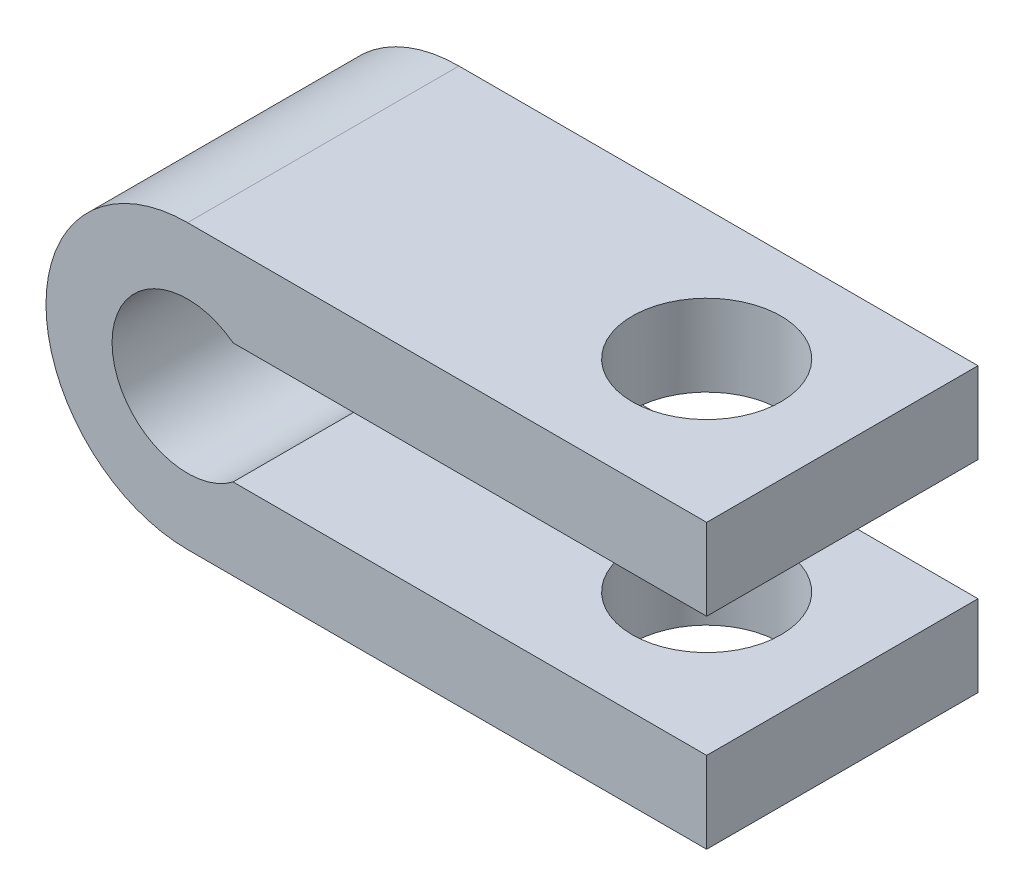
ISO-10303-21;
HEADER;
FILE_DESCRIPTION(('STEP AP214'),'2;1');
FILE_NAME('part.step','',(''),(''),'','','');
FILE_SCHEMA(('AUTOMOTIVE_DESIGN { 1 0 10303 214 1 1 1 1 }'));
ENDSEC;
DATA;
#1=APPLICATION_CONTEXT('core data for automotive mechanical design processes');
#2=APPLICATION_PROTOCOL_DEFINITION('international standard','automotive_design',2000,#1);
#3=PRODUCT_CONTEXT('',#1,'mechanical');
#4=PRODUCT('Part','Part','',(#3));
#5=PRODUCT_RELATED_PRODUCT_CATEGORY('part','',(#4));
#6=PRODUCT_DEFINITION_FORMATION('','',#4);
#7=PRODUCT_DEFINITION_CONTEXT('part definition',#1,'design');
#8=PRODUCT_DEFINITION('design','',#6,#7);
#9=PRODUCT_DEFINITION_SHAPE('','',#8);
#10=(LENGTH_UNIT() NAMED_UNIT(*) SI_UNIT(.MILLI.,.METRE.));
#11=(NAMED_UNIT(*) PLANE_ANGLE_UNIT() SI_UNIT($,.RADIAN.));
#12=(NAMED_UNIT(*) SI_UNIT($,.STERADIAN.) SOLID_ANGLE_UNIT());
#13=UNCERTAINTY_MEASURE_WITH_UNIT(LENGTH_MEASURE(1.E-05),#10,'distance_accuracy_value','');
#14=(GEOMETRIC_REPRESENTATION_CONTEXT(3) GLOBAL_UNCERTAINTY_ASSIGNED_CONTEXT((#13)) GLOBAL_UNIT_ASSIGNED_CONTEXT((#10,
#11,#12)) REPRESENTATION_CONTEXT('',''));
#15=CARTESIAN_POINT('',(0.,0.,0.));
#16=DIRECTION('',(0.,0.,1.));
#17=DIRECTION('',(1.,0.,0.));
#18=AXIS2_PLACEMENT_3D('',#15,#16,#17);
#19=CARTESIAN_POINT('',(0.,0.,12.));
#20=DIRECTION('',(0.,0.,-1.));
#21=DIRECTION('',(-1.,0.,0.));
#22=AXIS2_PLACEMENT_3D('',#19,#20,#21);
#23=CYLINDRICAL_SURFACE('',#22,3.2);
#24=DIRECTION('',(0.,0.,-1.));
#25=VECTOR('',#24,1.);
#26=CARTESIAN_POINT('',(1.92968099110157,-2.55271057360235,12.));
#27=LINE('',#26,#25);
#28=CARTESIAN_POINT('',(1.92968099110157,-2.55271057360235,12.));
#29=VERTEX_POINT('',#28);
#30=CARTESIAN_POINT('',(1.92968099110157,-2.55271057360235,0.499999999999995));
#31=VERTEX_POINT('',#30);
#32=EDGE_CURVE('E253',#29,#31,#27,.T.);
#33=ORIENTED_EDGE('',*,*,#32,.T.);
#34=CARTESIAN_POINT('',(0.,0.,0.499999999999995));
#35=DIRECTION('',(0.,0.,1.));
#36=DIRECTION('',(1.,0.,0.));
#37=AXIS2_PLACEMENT_3D('',#34,#35,#36);
#38=CIRCLE('',#37,3.2);
#39=CARTESIAN_POINT('',(1.92968099110157,2.55271057360235,0.499999999999995));
#40=VERTEX_POINT('',#39);
#41=EDGE_CURVE('E11',#31,#40,#38,.F.);
#42=ORIENTED_EDGE('',*,*,#41,.T.);
#43=DIRECTION('',(0.,0.,-1.));
#44=VECTOR('',#43,1.);
#45=CARTESIAN_POINT('',(1.92968099110157,2.55271057360235,12.));
#46=LINE('',#45,#44);
#47=CARTESIAN_POINT('',(1.92968099110157,2.55271057360235,12.));
#48=VERTEX_POINT('',#47);
#49=EDGE_CURVE('E127',#48,#40,#46,.T.);
#50=ORIENTED_EDGE('',*,*,#49,.F.);
#51=CARTESIAN_POINT('',(0.,0.,12.));
#52=DIRECTION('',(0.,0.,-1.));
#53=DIRECTION('',(1.,0.,0.));
#54=AXIS2_PLACEMENT_3D('',#51,#52,#53);
#55=CIRCLE('',#54,3.2);
#56=EDGE_CURVE('E134',#29,#48,#55,.T.);
#57=ORIENTED_EDGE('',*,*,#56,.F.);
#58=EDGE_LOOP('',(#33,#42,#50,#57));
#59=FACE_BOUND('',#58,.T.);
#60=ADVANCED_FACE('F34',(#59),#23,.F.);
#61=CARTESIAN_POINT('',(22.,2.55271057360236,12.));
#62=DIRECTION('',(0.,1.,0.));
#63=DIRECTION('',(-1.,0.,0.));
#64=AXIS2_PLACEMENT_3D('',#61,#62,#63);
#65=PLANE('',#64);
#66=CARTESIAN_POINT('',(16.,2.55271057360236,6.));
#67=DIRECTION('',(0.,1.,0.));
#68=DIRECTION('',(-1.,0.,0.));
#69=AXIS2_PLACEMENT_3D('',#66,#67,#68);
#70=CIRCLE('',#69,3.15);
#71=CARTESIAN_POINT('',(12.85,2.55271057360236,6.));
#72=VERTEX_POINT('',#71);
#73=EDGE_CURVE('E140',#72,#72,#70,.T.);
#74=ORIENTED_EDGE('',*,*,#73,.T.);
#75=EDGE_LOOP('',(#74));
#76=FACE_BOUND('',#75,.T.);
#77=ORIENTED_EDGE('',*,*,#49,.T.);
#78=DIRECTION('',(1.,0.,0.));
#79=VECTOR('',#78,1.);
#80=CARTESIAN_POINT('',(22.,2.55271057360236,0.499999999999995));
#81=LINE('',#80,#79);
#82=CARTESIAN_POINT('',(22.,2.55271057360236,0.499999999999995));
#83=VERTEX_POINT('',#82);
#84=EDGE_CURVE('E179',#40,#83,#81,.T.);
#85=ORIENTED_EDGE('',*,*,#84,.T.);
#86=DIRECTION('',(0.,0.,-1.));
#87=VECTOR('',#86,1.);
#88=CARTESIAN_POINT('',(22.,2.55271057360236,12.));
#89=LINE('',#88,#87);
#90=CARTESIAN_POINT('',(22.,2.55271057360236,12.));
#91=VERTEX_POINT('',#90);
#92=EDGE_CURVE('E130',#91,#83,#89,.T.);
#93=ORIENTED_EDGE('',*,*,#92,.F.);
#94=DIRECTION('',(1.,0.,0.));
#95=VECTOR('',#94,1.);
#96=CARTESIAN_POINT('',(22.,2.55271057360236,12.));
#97=LINE('',#96,#95);
#98=EDGE_CURVE('E124',#48,#91,#97,.T.);
#99=ORIENTED_EDGE('',*,*,#98,.F.);
#100=EDGE_LOOP('',(#77,#85,#93,#99));
#101=FACE_BOUND('',#100,.T.);
#102=ADVANCED_FACE('F126',(#76,#101),#65,.F.);
#103=CARTESIAN_POINT('',(22.,6.,12.));
#104=DIRECTION('',(-1.,0.,0.));
#105=DIRECTION('',(0.,0.,1.));
#106=AXIS2_PLACEMENT_3D('',#103,#104,#105);
#107=PLANE('',#106);
#108=ORIENTED_EDGE('',*,*,#92,.T.);
#109=DIRECTION('',(0.,1.,0.));
#110=VECTOR('',#109,1.);
#111=CARTESIAN_POINT('',(22.,6.,0.499999999999995));
#112=LINE('',#111,#110);
#113=CARTESIAN_POINT('',(22.,6.,0.499999999999995));
#114=VERTEX_POINT('',#113);
#115=EDGE_CURVE('E177',#83,#114,#112,.T.);
#116=ORIENTED_EDGE('',*,*,#115,.T.);
#117=DIRECTION('',(0.,0.,-1.));
#118=VECTOR('',#117,1.);
#119=CARTESIAN_POINT('',(22.,6.,12.));
#120=LINE('',#119,#118);
#121=CARTESIAN_POINT('',(22.,6.,12.));
#122=VERTEX_POINT('',#121);
#123=EDGE_CURVE('E147',#122,#114,#120,.T.);
#124=ORIENTED_EDGE('',*,*,#123,.F.);
#125=DIRECTION('',(0.,1.,0.));
#126=VECTOR('',#125,1.);
#127=CARTESIAN_POINT('',(22.,6.,12.));
#128=LINE('',#127,#126);
#129=EDGE_CURVE('E133',#91,#122,#128,.T.);
#130=ORIENTED_EDGE('',*,*,#129,.F.);
#131=EDGE_LOOP('',(#108,#116,#124,#130));
#132=FACE_BOUND('',#131,.T.);
#133=ADVANCED_FACE('F292',(#132),#107,.F.);
#134=CARTESIAN_POINT('',(0.,6.,12.));
#135=DIRECTION('',(0.,-1.,0.));
#136=DIRECTION('',(0.,0.,-1.));
#137=AXIS2_PLACEMENT_3D('',#134,#135,#136);
#138=PLANE('',#137);
#139=CARTESIAN_POINT('',(16.,6.,6.));
#140=DIRECTION('',(0.,1.,0.));
#141=DIRECTION('',(0.,0.,1.));
#142=AXIS2_PLACEMENT_3D('',#139,#140,#141);
#143=CIRCLE('',#142,3.15);
#144=CARTESIAN_POINT('',(16.,6.,9.15));
#145=VERTEX_POINT('',#144);
#146=EDGE_CURVE('E229',#145,#145,#143,.T.);
#147=ORIENTED_EDGE('',*,*,#146,.F.);
#148=EDGE_LOOP('',(#147));
#149=FACE_BOUND('',#148,.T.);
#150=ORIENTED_EDGE('',*,*,#123,.T.);
#151=DIRECTION('',(-1.,0.,0.));
#152=VECTOR('',#151,1.);
#153=CARTESIAN_POINT('',(0.,6.,0.499999999999995));
#154=LINE('',#153,#152);
#155=CARTESIAN_POINT('',(0.,6.,0.499999999999995));
#156=VERTEX_POINT('',#155);
#157=EDGE_CURVE('E175',#114,#156,#154,.T.);
#158=ORIENTED_EDGE('',*,*,#157,.T.);
#159=DIRECTION('',(0.,0.,-1.));
#160=VECTOR('',#159,1.);
#161=CARTESIAN_POINT('',(0.,6.,12.));
#162=LINE('',#161,#160);
#163=CARTESIAN_POINT('',(0.,6.,12.));
#164=VERTEX_POINT('',#163);
#165=EDGE_CURVE('E263',#164,#156,#162,.T.);
#166=ORIENTED_EDGE('',*,*,#165,.F.);
#167=DIRECTION('',(-1.,0.,0.));
#168=VECTOR('',#167,1.);
#169=CARTESIAN_POINT('',(0.,6.,12.));
#170=LINE('',#169,#168);
#171=EDGE_CURVE('E244',#122,#164,#170,.T.);
#172=ORIENTED_EDGE('',*,*,#171,.F.);
#173=EDGE_LOOP('',(#150,#158,#166,#172));
#174=FACE_BOUND('',#173,.T.);
#175=ADVANCED_FACE('F269',(#149,#174),#138,.F.);
#176=CARTESIAN_POINT('',(0.,0.,12.));
#177=DIRECTION('',(0.,0.,-1.));
#178=DIRECTION('',(-1.,0.,0.));
#179=AXIS2_PLACEMENT_3D('',#176,#177,#178);
#180=CYLINDRICAL_SURFACE('',#179,6.);
#181=ORIENTED_EDGE('',*,*,#165,.T.);
#182=CARTESIAN_POINT('',(0.,0.,0.499999999999995));
#183=DIRECTION('',(0.,0.,1.));
#184=DIRECTION('',(1.,0.,0.));
#185=AXIS2_PLACEMENT_3D('',#182,#183,#184);
#186=CIRCLE('',#185,6.);
#187=CARTESIAN_POINT('',(0.,-6.,0.499999999999995));
#188=VERTEX_POINT('',#187);
#189=EDGE_CURVE('E173',#156,#188,#186,.T.);
#190=ORIENTED_EDGE('',*,*,#189,.T.);
#191=DIRECTION('',(0.,0.,-1.));
#192=VECTOR('',#191,1.);
#193=CARTESIAN_POINT('',(0.,-6.,12.));
#194=LINE('',#193,#192);
#195=CARTESIAN_POINT('',(0.,-6.,12.));
#196=VERTEX_POINT('',#195);
#197=EDGE_CURVE('E260',#196,#188,#194,.T.);
#198=ORIENTED_EDGE('',*,*,#197,.F.);
#199=CARTESIAN_POINT('',(0.,0.,12.));
#200=DIRECTION('',(0.,0.,1.));
#201=DIRECTION('',(1.,0.,0.));
#202=AXIS2_PLACEMENT_3D('',#199,#200,#201);
#203=CIRCLE('',#202,6.);
#204=EDGE_CURVE('E246',#164,#196,#203,.T.);
#205=ORIENTED_EDGE('',*,*,#204,.F.);
#206=EDGE_LOOP('',(#181,#190,#198,#205));
#207=FACE_BOUND('',#206,.T.);
#208=ADVANCED_FACE('F284',(#207),#180,.T.);
#209=CARTESIAN_POINT('',(0.,-6.,12.));
#210=DIRECTION('',(0.,1.,0.));
#211=DIRECTION('',(0.,0.,1.));
#212=AXIS2_PLACEMENT_3D('',#209,#210,#211);
#213=PLANE('',#212);
#214=CARTESIAN_POINT('',(16.,-6.,6.));
#215=DIRECTION('',(0.,1.,0.));
#216=DIRECTION('',(0.,0.,1.));
#217=AXIS2_PLACEMENT_3D('',#214,#215,#216);
#218=CIRCLE('',#217,3.15);
#219=CARTESIAN_POINT('',(16.,-6.,9.15));
#220=VERTEX_POINT('',#219);
#221=EDGE_CURVE('E153',#220,#220,#218,.T.);
#222=ORIENTED_EDGE('',*,*,#221,.T.);
#223=EDGE_LOOP('',(#222));
#224=FACE_BOUND('',#223,.T.);
#225=ORIENTED_EDGE('',*,*,#197,.T.);
#226=DIRECTION('',(1.,0.,0.));
#227=VECTOR('',#226,1.);
#228=CARTESIAN_POINT('',(0.,-6.,0.499999999999995));
#229=LINE('',#228,#227);
#230=CARTESIAN_POINT('',(22.,-6.,0.499999999999995));
#231=VERTEX_POINT('',#230);
#232=EDGE_CURVE('E171',#188,#231,#229,.T.);
#233=ORIENTED_EDGE('',*,*,#232,.T.);
#234=DIRECTION('',(0.,0.,-1.));
#235=VECTOR('',#234,1.);
#236=CARTESIAN_POINT('',(22.,-6.,12.));
#237=LINE('',#236,#235);
#238=CARTESIAN_POINT('',(22.,-6.,12.));
#239=VERTEX_POINT('',#238);
#240=EDGE_CURVE('E257',#239,#231,#237,.T.);
#241=ORIENTED_EDGE('',*,*,#240,.F.);
#242=DIRECTION('',(1.,0.,0.));
#243=VECTOR('',#242,1.);
#244=CARTESIAN_POINT('',(0.,-6.,12.));
#245=LINE('',#244,#243);
#246=EDGE_CURVE('E248',#196,#239,#245,.T.);
#247=ORIENTED_EDGE('',*,*,#246,.F.);
#248=EDGE_LOOP('',(#225,#233,#241,#247));
#249=FACE_BOUND('',#248,.T.);
#250=ADVANCED_FACE('F288',(#224,#249),#213,.F.);
#251=CARTESIAN_POINT('',(22.,-6.,12.));
#252=DIRECTION('',(-1.,0.,0.));
#253=DIRECTION('',(0.,0.,1.));
#254=AXIS2_PLACEMENT_3D('',#251,#252,#253);
#255=PLANE('',#254);
#256=ORIENTED_EDGE('',*,*,#240,.T.);
#257=DIRECTION('',(0.,1.,0.));
#258=VECTOR('',#257,1.);
#259=CARTESIAN_POINT('',(22.,-6.,0.499999999999995));
#260=LINE('',#259,#258);
#261=CARTESIAN_POINT('',(22.,-2.55271057360236,0.499999999999995));
#262=VERTEX_POINT('',#261);
#263=EDGE_CURVE('E142',#231,#262,#260,.T.);
#264=ORIENTED_EDGE('',*,*,#263,.T.);
#265=DIRECTION('',(0.,0.,-1.));
#266=VECTOR('',#265,1.);
#267=CARTESIAN_POINT('',(22.,-2.55271057360236,12.));
#268=LINE('',#267,#266);
#269=CARTESIAN_POINT('',(22.,-2.55271057360236,12.));
#270=VERTEX_POINT('',#269);
#271=EDGE_CURVE('E255',#270,#262,#268,.T.);
#272=ORIENTED_EDGE('',*,*,#271,.F.);
#273=DIRECTION('',(0.,1.,0.));
#274=VECTOR('',#273,1.);
#275=CARTESIAN_POINT('',(22.,-6.,12.));
#276=LINE('',#275,#274);
#277=EDGE_CURVE('E250',#239,#270,#276,.T.);
#278=ORIENTED_EDGE('',*,*,#277,.F.);
#279=EDGE_LOOP('',(#256,#264,#272,#278));
#280=FACE_BOUND('',#279,.T.);
#281=ADVANCED_FACE('F322',(#280),#255,.F.);
#282=CARTESIAN_POINT('',(22.,-2.55271057360236,12.));
#283=DIRECTION('',(0.,-1.,0.));
#284=DIRECTION('',(1.,0.,0.));
#285=AXIS2_PLACEMENT_3D('',#282,#283,#284);
#286=PLANE('',#285);
#287=CARTESIAN_POINT('',(16.,-2.55271057360236,6.));
#288=DIRECTION('',(0.,-1.,0.));
#289=DIRECTION('',(1.,0.,0.));
#290=AXIS2_PLACEMENT_3D('',#287,#288,#289);
#291=CIRCLE('',#290,3.15);
#292=CARTESIAN_POINT('',(19.15,-2.55271057360236,6.));
#293=VERTEX_POINT('',#292);
#294=EDGE_CURVE('E151',#293,#293,#291,.T.);
#295=ORIENTED_EDGE('',*,*,#294,.T.);
#296=EDGE_LOOP('',(#295));
#297=FACE_BOUND('',#296,.T.);
#298=ORIENTED_EDGE('',*,*,#271,.T.);
#299=DIRECTION('',(-1.,0.,0.));
#300=VECTOR('',#299,1.);
#301=CARTESIAN_POINT('',(22.,-2.55271057360236,0.499999999999995));
#302=LINE('',#301,#300);
#303=EDGE_CURVE('E43',#262,#31,#302,.T.);
#304=ORIENTED_EDGE('',*,*,#303,.T.);
#305=ORIENTED_EDGE('',*,*,#32,.F.);
#306=DIRECTION('',(-1.,0.,0.));
#307=VECTOR('',#306,1.);
#308=CARTESIAN_POINT('',(22.,-2.55271057360236,12.));
#309=LINE('',#308,#307);
#310=EDGE_CURVE('E139',#270,#29,#309,.T.);
#311=ORIENTED_EDGE('',*,*,#310,.F.);
#312=EDGE_LOOP('',(#298,#304,#305,#311));
#313=FACE_BOUND('',#312,.T.);
#314=ADVANCED_FACE('F323',(#297,#313),#286,.F.);
#315=CARTESIAN_POINT('',(0.,0.,12.));
#316=DIRECTION('',(0.,0.,1.));
#317=DIRECTION('',(1.,0.,0.));
#318=AXIS2_PLACEMENT_3D('',#315,#316,#317);
#319=PLANE('',#318);
#320=ORIENTED_EDGE('',*,*,#56,.T.);
#321=ORIENTED_EDGE('',*,*,#98,.T.);
#322=ORIENTED_EDGE('',*,*,#129,.T.);
#323=ORIENTED_EDGE('',*,*,#171,.T.);
#324=ORIENTED_EDGE('',*,*,#204,.T.);
#325=ORIENTED_EDGE('',*,*,#246,.T.);
#326=ORIENTED_EDGE('',*,*,#277,.T.);
#327=ORIENTED_EDGE('',*,*,#310,.T.);
#328=EDGE_LOOP('',(#320,#321,#322,#323,#324,#325,#326,#327));
#329=FACE_BOUND('',#328,.T.);
#330=ADVANCED_FACE('F137',(#329),#319,.T.);
#331=CARTESIAN_POINT('',(0.,0.,0.));
#332=DIRECTION('',(0.,0.,1.));
#333=DIRECTION('',(1.,0.,0.));
#334=AXIS2_PLACEMENT_3D('',#331,#332,#333);
#335=PLANE('',#334);
#336=DIRECTION('',(1.,0.,0.));
#337=VECTOR('',#336,1.);
#338=CARTESIAN_POINT('',(0.,-3.05271057360235,0.));
#339=LINE('',#338,#337);
#340=CARTESIAN_POINT('',(2.09068365704054,-3.05271057360235,0.));
#341=VERTEX_POINT('',#340);
#342=CARTESIAN_POINT('',(21.5,-3.05271057360236,0.));
#343=VERTEX_POINT('',#342);
#344=EDGE_CURVE('E156',#341,#343,#339,.T.);
#345=ORIENTED_EDGE('',*,*,#344,.T.);
#346=DIRECTION('',(0.,-1.,0.));
#347=VECTOR('',#346,1.);
#348=CARTESIAN_POINT('',(21.5,0.,0.));
#349=LINE('',#348,#347);
#350=CARTESIAN_POINT('',(21.5,-5.5,0.));
#351=VERTEX_POINT('',#350);
#352=EDGE_CURVE('E168',#343,#351,#349,.T.);
#353=ORIENTED_EDGE('',*,*,#352,.T.);
#354=DIRECTION('',(-1.,0.,0.));
#355=VECTOR('',#354,1.);
#356=CARTESIAN_POINT('',(0.,-5.5,0.));
#357=LINE('',#356,#355);
#358=CARTESIAN_POINT('',(0.,-5.5,0.));
#359=VERTEX_POINT('',#358);
#360=EDGE_CURVE('E166',#351,#359,#357,.T.);
#361=ORIENTED_EDGE('',*,*,#360,.T.);
#362=CARTESIAN_POINT('',(0.,0.,0.));
#363=DIRECTION('',(0.,0.,1.));
#364=DIRECTION('',(1.,0.,0.));
#365=AXIS2_PLACEMENT_3D('',#362,#363,#364);
#366=CIRCLE('',#365,5.5);
#367=CARTESIAN_POINT('',(0.,5.5,0.));
#368=VERTEX_POINT('',#367);
#369=EDGE_CURVE('E164',#359,#368,#366,.F.);
#370=ORIENTED_EDGE('',*,*,#369,.T.);
#371=DIRECTION('',(1.,0.,0.));
#372=VECTOR('',#371,1.);
#373=CARTESIAN_POINT('',(0.,5.5,0.));
#374=LINE('',#373,#372);
#375=CARTESIAN_POINT('',(21.5,5.5,0.));
#376=VERTEX_POINT('',#375);
#377=EDGE_CURVE('E162',#368,#376,#374,.T.);
#378=ORIENTED_EDGE('',*,*,#377,.T.);
#379=DIRECTION('',(0.,-1.,0.));
#380=VECTOR('',#379,1.);
#381=CARTESIAN_POINT('',(21.5,0.,0.));
#382=LINE('',#381,#380);
#383=CARTESIAN_POINT('',(21.5,3.05271057360236,0.));
#384=VERTEX_POINT('',#383);
#385=EDGE_CURVE('E160',#376,#384,#382,.T.);
#386=ORIENTED_EDGE('',*,*,#385,.T.);
#387=DIRECTION('',(-1.,0.,0.));
#388=VECTOR('',#387,1.);
#389=CARTESIAN_POINT('',(0.,3.05271057360235,0.));
#390=LINE('',#389,#388);
#391=CARTESIAN_POINT('',(2.09068365704054,3.05271057360235,0.));
#392=VERTEX_POINT('',#391);
#393=EDGE_CURVE('E158',#384,#392,#390,.T.);
#394=ORIENTED_EDGE('',*,*,#393,.T.);
#395=CARTESIAN_POINT('',(0.,0.,0.));
#396=DIRECTION('',(0.,0.,1.));
#397=DIRECTION('',(1.,0.,0.));
#398=AXIS2_PLACEMENT_3D('',#395,#396,#397);
#399=CIRCLE('',#398,3.7);
#400=EDGE_CURVE('E145',#392,#341,#399,.T.);
#401=ORIENTED_EDGE('',*,*,#400,.T.);
#402=EDGE_LOOP('',(#345,#353,#361,#370,#378,#386,#394,#401));
#403=FACE_BOUND('',#402,.T.);
#404=ADVANCED_FACE('F317',(#403),#335,.F.);
#405=CARTESIAN_POINT('',(16.,-6.,6.));
#406=DIRECTION('',(0.,1.,0.));
#407=DIRECTION('',(0.,0.,1.));
#408=AXIS2_PLACEMENT_3D('',#405,#406,#407);
#409=CYLINDRICAL_SURFACE('',#408,3.15);
#410=ORIENTED_EDGE('',*,*,#221,.F.);
#411=EDGE_LOOP('',(#410));
#412=FACE_BOUND('',#411,.T.);
#413=ORIENTED_EDGE('',*,*,#294,.F.);
#414=EDGE_LOOP('',(#413));
#415=FACE_BOUND('',#414,.T.);
#416=ADVANCED_FACE('F354',(#412,#415),#409,.F.);
#417=ORIENTED_EDGE('',*,*,#146,.T.);
#418=EDGE_LOOP('',(#417));
#419=FACE_BOUND('',#418,.T.);
#420=ORIENTED_EDGE('',*,*,#73,.F.);
#421=EDGE_LOOP('',(#420));
#422=FACE_BOUND('',#421,.T.);
#423=ADVANCED_FACE('F347',(#419,#422),#409,.F.);
#424=CARTESIAN_POINT('',(22.,6.,0.499999999999995));
#425=DIRECTION('',(-0.707106781186546,0.,0.707106781186549));
#426=DIRECTION('',(0.,1.,0.));
#427=AXIS2_PLACEMENT_3D('',#424,#425,#426);
#428=PLANE('',#427);
#429=DIRECTION('',(0.577350269189626,-0.577350269189627,0.577350269189624));
#430=VECTOR('',#429,1.);
#431=CARTESIAN_POINT('',(22.,2.55271057360236,0.499999999999995));
#432=LINE('',#431,#430);
#433=EDGE_CURVE('E224',#384,#83,#432,.T.);
#434=ORIENTED_EDGE('',*,*,#433,.F.);
#435=ORIENTED_EDGE('',*,*,#385,.F.);
#436=DIRECTION('',(0.577350269189626,0.577350269189628,0.577350269189624));
#437=VECTOR('',#436,1.);
#438=CARTESIAN_POINT('',(22.,6.,0.499999999999995));
#439=LINE('',#438,#437);
#440=EDGE_CURVE('E38',#114,#376,#439,.F.);
#441=ORIENTED_EDGE('',*,*,#440,.F.);
#442=ORIENTED_EDGE('',*,*,#115,.F.);
#443=EDGE_LOOP('',(#434,#435,#441,#442));
#444=FACE_BOUND('',#443,.T.);
#445=ADVANCED_FACE('F36',(#444),#428,.F.);
#446=CARTESIAN_POINT('',(0.,6.,0.499999999999995));
#447=DIRECTION('',(0.,-0.707106781186545,0.70710678118655));
#448=DIRECTION('',(-1.,0.,0.));
#449=AXIS2_PLACEMENT_3D('',#446,#447,#448);
#450=PLANE('',#449);
#451=ORIENTED_EDGE('',*,*,#440,.T.);
#452=ORIENTED_EDGE('',*,*,#377,.F.);
#453=DIRECTION('',(0.,-0.70710678118655,-0.707106781186545));
#454=VECTOR('',#453,1.);
#455=CARTESIAN_POINT('',(0.,6.,0.499999999999995));
#456=LINE('',#455,#454);
#457=EDGE_CURVE('E222',#156,#368,#456,.T.);
#458=ORIENTED_EDGE('',*,*,#457,.F.);
#459=ORIENTED_EDGE('',*,*,#157,.F.);
#460=EDGE_LOOP('',(#451,#452,#458,#459));
#461=FACE_BOUND('',#460,.T.);
#462=ADVANCED_FACE('F214',(#461),#450,.F.);
#463=CARTESIAN_POINT('',(22.,2.55271057360236,0.499999999999995));
#464=DIRECTION('',(0.,0.707106781186546,0.707106781186549));
#465=DIRECTION('',(1.,0.,0.));
#466=AXIS2_PLACEMENT_3D('',#463,#464,#465);
#467=PLANE('',#466);
#468=ORIENTED_EDGE('',*,*,#433,.T.);
#469=ORIENTED_EDGE('',*,*,#84,.F.);
#470=CARTESIAN_POINT('',(2.09068365704054,3.05271057360235,0.));
#471=CARTESIAN_POINT('',(2.06487118529539,2.96921292662803,0.0834976469743253));
#472=CARTESIAN_POINT('',(2.03854807955508,2.885797493086,0.166913080516349));
#473=CARTESIAN_POINT('',(1.98488052702275,2.71913082597164,0.333579747630707));
#474=CARTESIAN_POINT('',(1.95753607745007,2.635879592847,0.416830980755348));
#475=CARTESIAN_POINT('',(1.92968099110157,2.55271057360235,0.499999999999995));
#476=B_SPLINE_CURVE_WITH_KNOTS('',3,(#470,#471,#472,#473,#474,#475),.UNSPECIFIED.,.F.,.F.,(4,2,
4),(0.,0.36260526060223,0.725211508485266),.UNSPECIFIED.);
#477=EDGE_CURVE('E216',#392,#40,#476,.T.);
#478=ORIENTED_EDGE('',*,*,#477,.F.);
#479=ORIENTED_EDGE('',*,*,#393,.F.);
#480=EDGE_LOOP('',(#468,#469,#478,#479));
#481=FACE_BOUND('',#480,.T.);
#482=ADVANCED_FACE('F209',(#481),#467,.F.);
#483=CARTESIAN_POINT('',(0.,0.,0.499999999999995));
#484=DIRECTION('',(0.,0.,1.));
#485=DIRECTION('',(1.,0.,0.));
#486=AXIS2_PLACEMENT_3D('',#483,#484,#485);
#487=CONICAL_SURFACE('',#486,6.,0.785398163397452);
#488=ORIENTED_EDGE('',*,*,#457,.T.);
#489=ORIENTED_EDGE('',*,*,#369,.F.);
#490=DIRECTION('',(0.,0.70710678118655,-0.707106781186545));
#491=VECTOR('',#490,1.);
#492=CARTESIAN_POINT('',(0.,-6.,0.499999999999995));
#493=LINE('',#492,#491);
#494=EDGE_CURVE('E194',#188,#359,#493,.T.);
#495=ORIENTED_EDGE('',*,*,#494,.F.);
#496=ORIENTED_EDGE('',*,*,#189,.F.);
#497=EDGE_LOOP('',(#488,#489,#495,#496));
#498=FACE_BOUND('',#497,.T.);
#499=ADVANCED_FACE('F213',(#498),#487,.T.);
#500=CARTESIAN_POINT('',(0.,0.,0.499999999999995));
#501=DIRECTION('',(0.,0.,-1.));
#502=DIRECTION('',(-1.,0.,0.));
#503=AXIS2_PLACEMENT_3D('',#500,#501,#502);
#504=CONICAL_SURFACE('',#503,3.2,0.785398163397451);
#505=ORIENTED_EDGE('',*,*,#477,.T.);
#506=ORIENTED_EDGE('',*,*,#41,.F.);
#507=CARTESIAN_POINT('',(1.92968099110157,-2.55271057360235,0.499999999999995));
#508=CARTESIAN_POINT('',(1.95753607745007,-2.635879592847,0.416830980755348));
#509=CARTESIAN_POINT('',(1.98488052702275,-2.71913082597164,0.333579747630707));
#510=CARTESIAN_POINT('',(2.03854807955508,-2.885797493086,0.166913080516349));
#511=CARTESIAN_POINT('',(2.06487118529539,-2.96921292662803,0.0834976469743251));
#512=CARTESIAN_POINT('',(2.09068365704054,-3.05271057360235,0.));
#513=B_SPLINE_CURVE_WITH_KNOTS('',3,(#507,#508,#509,#510,#511,#512),.UNSPECIFIED.,.F.,.F.,(4,2,
4),(0.,0.362606247883036,0.725211508485266),.UNSPECIFIED.);
#514=EDGE_CURVE('E186',#341,#31,#513,.F.);
#515=ORIENTED_EDGE('',*,*,#514,.F.);
#516=ORIENTED_EDGE('',*,*,#400,.F.);
#517=EDGE_LOOP('',(#505,#506,#515,#516));
#518=FACE_BOUND('',#517,.T.);
#519=ADVANCED_FACE('F196',(#518),#504,.F.);
#520=CARTESIAN_POINT('',(0.,-6.,0.499999999999995));
#521=DIRECTION('',(0.,0.707106781186545,0.70710678118655));
#522=DIRECTION('',(1.,0.,0.));
#523=AXIS2_PLACEMENT_3D('',#520,#521,#522);
#524=PLANE('',#523);
#525=ORIENTED_EDGE('',*,*,#494,.T.);
#526=ORIENTED_EDGE('',*,*,#360,.F.);
#527=DIRECTION('',(0.577350269189626,-0.577350269189628,0.577350269189624));
#528=VECTOR('',#527,1.);
#529=CARTESIAN_POINT('',(14.6666666666667,1.33333333333336,-6.83333333333331));
#530=LINE('',#529,#528);
#531=EDGE_CURVE('E184',#231,#351,#530,.F.);
#532=ORIENTED_EDGE('',*,*,#531,.F.);
#533=ORIENTED_EDGE('',*,*,#232,.F.);
#534=EDGE_LOOP('',(#525,#526,#532,#533));
#535=FACE_BOUND('',#534,.T.);
#536=ADVANCED_FACE('F204',(#535),#524,.F.);
#537=CARTESIAN_POINT('',(22.,-2.55271057360236,0.499999999999995));
#538=DIRECTION('',(0.,-0.707106781186546,0.707106781186549));
#539=DIRECTION('',(-1.,0.,0.));
#540=AXIS2_PLACEMENT_3D('',#537,#538,#539);
#541=PLANE('',#540);
#542=ORIENTED_EDGE('',*,*,#514,.T.);
#543=ORIENTED_EDGE('',*,*,#303,.F.);
#544=DIRECTION('',(-0.577350269189626,-0.577350269189627,-0.577350269189624));
#545=VECTOR('',#544,1.);
#546=CARTESIAN_POINT('',(22.,-2.55271057360236,0.499999999999995));
#547=LINE('',#546,#545);
#548=EDGE_CURVE('E182',#343,#262,#547,.F.);
#549=ORIENTED_EDGE('',*,*,#548,.F.);
#550=ORIENTED_EDGE('',*,*,#344,.F.);
#551=EDGE_LOOP('',(#542,#543,#549,#550));
#552=FACE_BOUND('',#551,.T.);
#553=ADVANCED_FACE('F199',(#552),#541,.F.);
#554=CARTESIAN_POINT('',(22.,-6.,0.499999999999995));
#555=DIRECTION('',(-0.707106781186546,0.,0.707106781186549));
#556=DIRECTION('',(0.,1.,0.));
#557=AXIS2_PLACEMENT_3D('',#554,#555,#556);
#558=PLANE('',#557);
#559=ORIENTED_EDGE('',*,*,#531,.T.);
#560=ORIENTED_EDGE('',*,*,#352,.F.);
#561=ORIENTED_EDGE('',*,*,#548,.T.);
#562=ORIENTED_EDGE('',*,*,#263,.F.);
#563=EDGE_LOOP('',(#559,#560,#561,#562));
#564=FACE_BOUND('',#563,.T.);
#565=ADVANCED_FACE('F203',(#564),#558,.F.);
#566=CLOSED_SHELL('',(#60,#102,#133,#175,#208,#250,#281,#314,#330,#404,#416,#423,#445,#462,#482,
#499,#519,#536,#553,#565));
#567=MANIFOLD_SOLID_BREP('B2',#566);
#568=ADVANCED_BREP_SHAPE_REPRESENTATION('',(#18,#567),#14);
#569=SHAPE_DEFINITION_REPRESENTATION(#9,#568);
ENDSEC;
END-ISO-10303-21;
